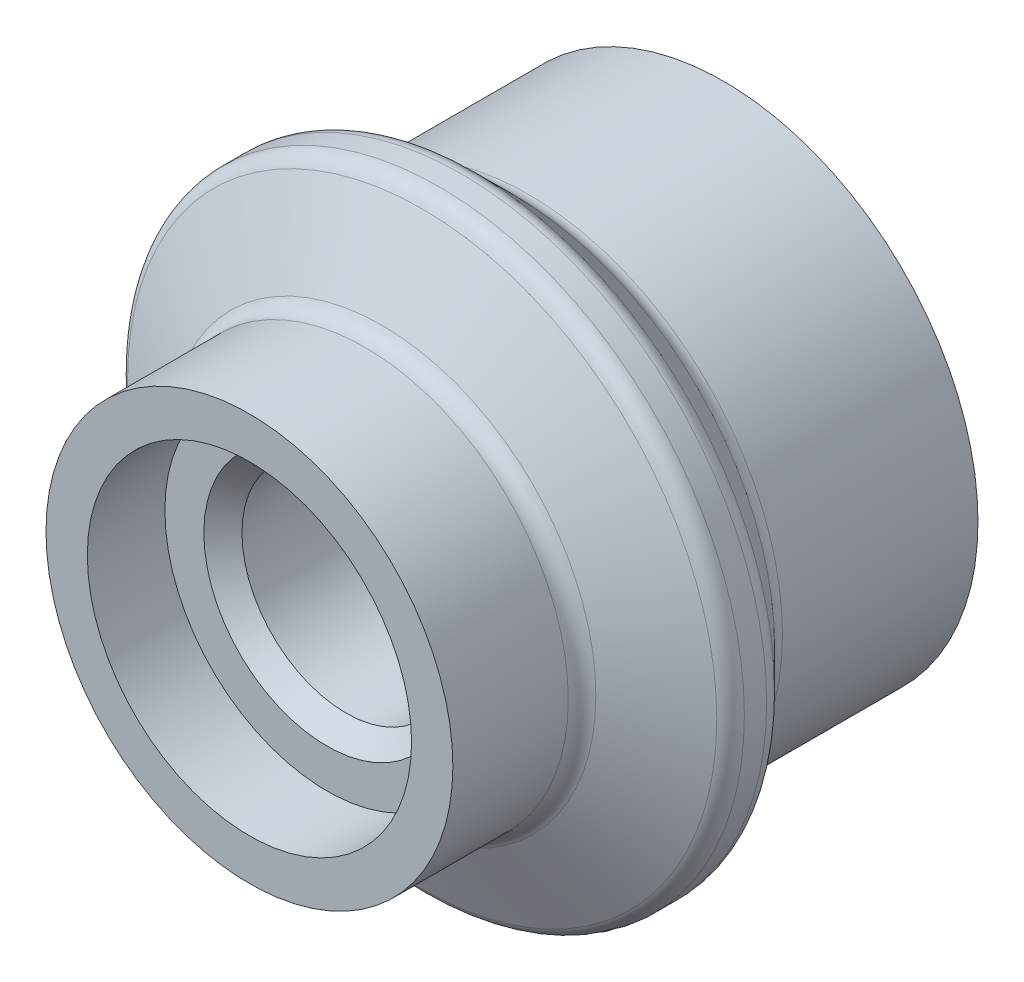
ISO-10303-21;
HEADER;
FILE_DESCRIPTION(('STEP AP214'),'2;1');
FILE_NAME('part.step','',(''),(''),'','','');
FILE_SCHEMA(('AUTOMOTIVE_DESIGN { 1 0 10303 214 1 1 1 1 }'));
ENDSEC;
DATA;
#1=APPLICATION_CONTEXT('core data for automotive mechanical design processes');
#2=APPLICATION_PROTOCOL_DEFINITION('international standard','automotive_design',2000,#1);
#3=PRODUCT_CONTEXT('',#1,'mechanical');
#4=PRODUCT('Part','Part','',(#3));
#5=PRODUCT_RELATED_PRODUCT_CATEGORY('part','',(#4));
#6=PRODUCT_DEFINITION_FORMATION('','',#4);
#7=PRODUCT_DEFINITION_CONTEXT('part definition',#1,'design');
#8=PRODUCT_DEFINITION('design','',#6,#7);
#9=PRODUCT_DEFINITION_SHAPE('','',#8);
#10=(LENGTH_UNIT() NAMED_UNIT(*) SI_UNIT(.MILLI.,.METRE.));
#11=(NAMED_UNIT(*) PLANE_ANGLE_UNIT() SI_UNIT($,.RADIAN.));
#12=(NAMED_UNIT(*) SI_UNIT($,.STERADIAN.) SOLID_ANGLE_UNIT());
#13=UNCERTAINTY_MEASURE_WITH_UNIT(LENGTH_MEASURE(1.E-05),#10,'distance_accuracy_value','');
#14=(GEOMETRIC_REPRESENTATION_CONTEXT(3) GLOBAL_UNCERTAINTY_ASSIGNED_CONTEXT((#13)) GLOBAL_UNIT_ASSIGNED_CONTEXT((#10,
#11,#12)) REPRESENTATION_CONTEXT('',''));
#15=CARTESIAN_POINT('',(0.,0.,0.));
#16=DIRECTION('',(0.,0.,1.));
#17=DIRECTION('',(1.,0.,0.));
#18=AXIS2_PLACEMENT_3D('',#15,#16,#17);
#19=CARTESIAN_POINT('',(0.,0.,0.));
#20=DIRECTION('',(0.,0.,1.));
#21=DIRECTION('',(1.,0.,0.));
#22=AXIS2_PLACEMENT_3D('',#19,#20,#21);
#23=PLANE('',#22);
#24=CARTESIAN_POINT('',(0.,0.,0.));
#25=DIRECTION('',(0.,0.,-1.));
#26=DIRECTION('',(-1.,0.,0.));
#27=AXIS2_PLACEMENT_3D('',#24,#25,#26);
#28=CIRCLE('',#27,11.5);
#29=CARTESIAN_POINT('',(-11.5,0.,0.));
#30=VERTEX_POINT('',#29);
#31=EDGE_CURVE('E96',#30,#30,#28,.T.);
#32=ORIENTED_EDGE('',*,*,#31,.F.);
#33=EDGE_LOOP('',(#32));
#34=FACE_BOUND('',#33,.T.);
#35=CARTESIAN_POINT('',(0.,0.,0.));
#36=DIRECTION('',(0.,0.,-1.));
#37=DIRECTION('',(-1.,0.,0.));
#38=AXIS2_PLACEMENT_3D('',#35,#36,#37);
#39=CIRCLE('',#38,20.);
#40=CARTESIAN_POINT('',(-20.,0.,0.));
#41=VERTEX_POINT('',#40);
#42=EDGE_CURVE('E103',#41,#41,#39,.T.);
#43=ORIENTED_EDGE('',*,*,#42,.T.);
#44=EDGE_LOOP('',(#43));
#45=FACE_BOUND('',#44,.T.);
#46=ADVANCED_FACE('F42',(#34,#45),#23,.F.);
#47=CARTESIAN_POINT('',(0.,0.,105.182250993909));
#48=DIRECTION('',(0.,0.,-1.));
#49=DIRECTION('',(-1.,0.,0.));
#50=AXIS2_PLACEMENT_3D('',#47,#48,#49);
#51=CYLINDRICAL_SURFACE('',#50,24.);
#52=CARTESIAN_POINT('',(0.,0.,20.6213203435597));
#53=DIRECTION('',(0.,0.,1.));
#54=DIRECTION('',(1.,0.,0.));
#55=AXIS2_PLACEMENT_3D('',#52,#53,#54);
#56=CIRCLE('',#55,24.);
#57=CARTESIAN_POINT('',(24.,0.,20.6213203435597));
#58=VERTEX_POINT('',#57);
#59=EDGE_CURVE('E51',#58,#58,#56,.T.);
#60=ORIENTED_EDGE('',*,*,#59,.T.);
#61=EDGE_LOOP('',(#60));
#62=FACE_BOUND('',#61,.T.);
#63=CARTESIAN_POINT('',(0.,0.,22.3729490168752));
#64=DIRECTION('',(0.,0.,1.));
#65=DIRECTION('',(1.,0.,0.));
#66=AXIS2_PLACEMENT_3D('',#63,#64,#65);
#67=CIRCLE('',#66,24.);
#68=CARTESIAN_POINT('',(24.,0.,22.3729490168752));
#69=VERTEX_POINT('',#68);
#70=EDGE_CURVE('E75',#69,#69,#67,.F.);
#71=ORIENTED_EDGE('',*,*,#70,.T.);
#72=EDGE_LOOP('',(#71));
#73=FACE_BOUND('',#72,.T.);
#74=ADVANCED_FACE('F126',(#62,#73),#51,.T.);
#75=CARTESIAN_POINT('',(0.,0.,37.3));
#76=DIRECTION('',(0.,0.,-1.));
#77=DIRECTION('',(-1.,0.,0.));
#78=AXIS2_PLACEMENT_3D('',#75,#76,#77);
#79=CYLINDRICAL_SURFACE('',#78,8.1875);
#80=CARTESIAN_POINT('',(0.,0.,29.7));
#81=DIRECTION('',(0.,0.,1.));
#82=DIRECTION('',(1.,0.,0.));
#83=AXIS2_PLACEMENT_3D('',#80,#81,#82);
#84=CIRCLE('',#83,8.1875);
#85=CARTESIAN_POINT('',(8.1875,0.,29.7));
#86=VERTEX_POINT('',#85);
#87=EDGE_CURVE('E85',#86,#86,#84,.T.);
#88=ORIENTED_EDGE('',*,*,#87,.T.);
#89=EDGE_LOOP('',(#88));
#90=FACE_BOUND('',#89,.T.);
#91=CARTESIAN_POINT('',(0.,0.,3.50000000000002));
#92=DIRECTION('',(0.,0.,-1.));
#93=DIRECTION('',(-1.,0.,0.));
#94=AXIS2_PLACEMENT_3D('',#91,#92,#93);
#95=CIRCLE('',#94,8.1875);
#96=CARTESIAN_POINT('',(-8.1875,0.,3.50000000000002));
#97=VERTEX_POINT('',#96);
#98=EDGE_CURVE('E84',#97,#97,#95,.T.);
#99=ORIENTED_EDGE('',*,*,#98,.T.);
#100=EDGE_LOOP('',(#99));
#101=FACE_BOUND('',#100,.T.);
#102=ADVANCED_FACE('F132',(#90,#101),#79,.F.);
#103=CARTESIAN_POINT('',(0.,0.,37.3));
#104=DIRECTION('',(0.,0.,1.));
#105=DIRECTION('',(1.,0.,0.));
#106=AXIS2_PLACEMENT_3D('',#103,#104,#105);
#107=PLANE('',#106);
#108=CARTESIAN_POINT('',(0.,0.,37.3));
#109=DIRECTION('',(0.,0.,1.));
#110=DIRECTION('',(1.,0.,0.));
#111=AXIS2_PLACEMENT_3D('',#108,#109,#110);
#112=CIRCLE('',#111,12.75);
#113=CARTESIAN_POINT('',(12.75,0.,37.3));
#114=VERTEX_POINT('',#113);
#115=EDGE_CURVE('E91',#114,#114,#112,.T.);
#116=ORIENTED_EDGE('',*,*,#115,.F.);
#117=EDGE_LOOP('',(#116));
#118=FACE_BOUND('',#117,.T.);
#119=CARTESIAN_POINT('',(0.,0.,37.3));
#120=DIRECTION('',(0.,0.,1.));
#121=DIRECTION('',(1.,0.,0.));
#122=AXIS2_PLACEMENT_3D('',#119,#120,#121);
#123=CIRCLE('',#122,16.);
#124=CARTESIAN_POINT('',(16.,0.,37.3));
#125=VERTEX_POINT('',#124);
#126=EDGE_CURVE('E87',#125,#125,#123,.T.);
#127=ORIENTED_EDGE('',*,*,#126,.T.);
#128=EDGE_LOOP('',(#127));
#129=FACE_BOUND('',#128,.T.);
#130=ADVANCED_FACE('F140',(#118,#129),#107,.T.);
#131=CARTESIAN_POINT('',(0.,0.,37.3));
#132=DIRECTION('',(0.,0.,-1.));
#133=DIRECTION('',(-1.,0.,0.));
#134=AXIS2_PLACEMENT_3D('',#131,#132,#133);
#135=CYLINDRICAL_SURFACE('',#134,16.);
#136=CARTESIAN_POINT('',(0.,0.,28.2270509831248));
#137=DIRECTION('',(0.,0.,-1.));
#138=DIRECTION('',(-1.,0.,0.));
#139=AXIS2_PLACEMENT_3D('',#136,#137,#138);
#140=CIRCLE('',#139,16.);
#141=CARTESIAN_POINT('',(-16.,0.,28.2270509831248));
#142=VERTEX_POINT('',#141);
#143=EDGE_CURVE('E63',#142,#142,#140,.F.);
#144=ORIENTED_EDGE('',*,*,#143,.T.);
#145=EDGE_LOOP('',(#144));
#146=FACE_BOUND('',#145,.T.);
#147=ORIENTED_EDGE('',*,*,#126,.F.);
#148=EDGE_LOOP('',(#147));
#149=FACE_BOUND('',#148,.T.);
#150=ADVANCED_FACE('F137',(#146,#149),#135,.T.);
#151=CARTESIAN_POINT('',(0.,0.,31.2));
#152=DIRECTION('',(0.,0.,1.));
#153=DIRECTION('',(1.,0.,0.));
#154=AXIS2_PLACEMENT_3D('',#151,#152,#153);
#155=CYLINDRICAL_SURFACE('',#154,12.75);
#156=CARTESIAN_POINT('',(0.,0.,31.2));
#157=DIRECTION('',(0.,0.,1.));
#158=DIRECTION('',(1.,0.,0.));
#159=AXIS2_PLACEMENT_3D('',#156,#157,#158);
#160=CIRCLE('',#159,12.75);
#161=CARTESIAN_POINT('',(12.75,0.,31.2));
#162=VERTEX_POINT('',#161);
#163=EDGE_CURVE('E94',#162,#162,#160,.T.);
#164=ORIENTED_EDGE('',*,*,#163,.F.);
#165=EDGE_LOOP('',(#164));
#166=FACE_BOUND('',#165,.T.);
#167=ORIENTED_EDGE('',*,*,#115,.T.);
#168=EDGE_LOOP('',(#167));
#169=FACE_BOUND('',#168,.T.);
#170=ADVANCED_FACE('F145',(#166,#169),#155,.F.);
#171=CARTESIAN_POINT('',(0.,0.,31.2));
#172=DIRECTION('',(0.,0.,1.));
#173=DIRECTION('',(1.,0.,0.));
#174=AXIS2_PLACEMENT_3D('',#171,#172,#173);
#175=PLANE('',#174);
#176=CARTESIAN_POINT('',(0.,0.,31.2));
#177=DIRECTION('',(0.,0.,1.));
#178=DIRECTION('',(1.,0.,0.));
#179=AXIS2_PLACEMENT_3D('',#176,#177,#178);
#180=CIRCLE('',#179,9.68750000000002);
#181=CARTESIAN_POINT('',(9.68750000000002,0.,31.2));
#182=VERTEX_POINT('',#181);
#183=EDGE_CURVE('E79',#182,#182,#180,.F.);
#184=ORIENTED_EDGE('',*,*,#183,.T.);
#185=EDGE_LOOP('',(#184));
#186=FACE_BOUND('',#185,.T.);
#187=ORIENTED_EDGE('',*,*,#163,.T.);
#188=EDGE_LOOP('',(#187));
#189=FACE_BOUND('',#188,.T.);
#190=ADVANCED_FACE('F258',(#186,#189),#175,.T.);
#191=CARTESIAN_POINT('',(0.,0.,2.));
#192=DIRECTION('',(0.,0.,-1.));
#193=DIRECTION('',(-1.,0.,0.));
#194=AXIS2_PLACEMENT_3D('',#191,#192,#193);
#195=CYLINDRICAL_SURFACE('',#194,11.5);
#196=CARTESIAN_POINT('',(0.,0.,2.));
#197=DIRECTION('',(0.,0.,-1.));
#198=DIRECTION('',(-1.,0.,0.));
#199=AXIS2_PLACEMENT_3D('',#196,#197,#198);
#200=CIRCLE('',#199,11.5);
#201=CARTESIAN_POINT('',(-11.5,0.,2.));
#202=VERTEX_POINT('',#201);
#203=EDGE_CURVE('E92',#202,#202,#200,.T.);
#204=ORIENTED_EDGE('',*,*,#203,.F.);
#205=EDGE_LOOP('',(#204));
#206=FACE_BOUND('',#205,.T.);
#207=ORIENTED_EDGE('',*,*,#31,.T.);
#208=EDGE_LOOP('',(#207));
#209=FACE_BOUND('',#208,.T.);
#210=ADVANCED_FACE('F125',(#206,#209),#195,.F.);
#211=CARTESIAN_POINT('',(0.,0.,2.));
#212=DIRECTION('',(0.,0.,-1.));
#213=DIRECTION('',(-1.,0.,0.));
#214=AXIS2_PLACEMENT_3D('',#211,#212,#213);
#215=PLANE('',#214);
#216=CARTESIAN_POINT('',(0.,0.,2.));
#217=DIRECTION('',(0.,0.,-1.));
#218=DIRECTION('',(-1.,0.,0.));
#219=AXIS2_PLACEMENT_3D('',#216,#217,#218);
#220=CIRCLE('',#219,9.68750000000002);
#221=CARTESIAN_POINT('',(-9.68750000000002,0.,2.));
#222=VERTEX_POINT('',#221);
#223=EDGE_CURVE('E77',#222,#222,#220,.F.);
#224=ORIENTED_EDGE('',*,*,#223,.T.);
#225=EDGE_LOOP('',(#224));
#226=FACE_BOUND('',#225,.T.);
#227=ORIENTED_EDGE('',*,*,#203,.T.);
#228=EDGE_LOOP('',(#227));
#229=FACE_BOUND('',#228,.T.);
#230=ADVANCED_FACE('F111',(#226,#229),#215,.T.);
#231=CARTESIAN_POINT('',(0.,0.,20.));
#232=DIRECTION('',(0.,0.,-1.));
#233=DIRECTION('',(-1.,0.,0.));
#234=AXIS2_PLACEMENT_3D('',#231,#232,#233);
#235=CYLINDRICAL_SURFACE('',#234,20.);
#236=CARTESIAN_POINT('',(0.,0.,15.3786796564403));
#237=DIRECTION('',(0.,0.,-1.));
#238=DIRECTION('',(-1.,0.,0.));
#239=AXIS2_PLACEMENT_3D('',#236,#237,#238);
#240=CIRCLE('',#239,20.);
#241=CARTESIAN_POINT('',(-20.,0.,15.3786796564403));
#242=VERTEX_POINT('',#241);
#243=EDGE_CURVE('E12',#242,#242,#240,.T.);
#244=ORIENTED_EDGE('',*,*,#243,.T.);
#245=EDGE_LOOP('',(#244));
#246=FACE_BOUND('',#245,.T.);
#247=ORIENTED_EDGE('',*,*,#42,.F.);
#248=EDGE_LOOP('',(#247));
#249=FACE_BOUND('',#248,.T.);
#250=ADVANCED_FACE('F108',(#246,#249),#235,.T.);
#251=CARTESIAN_POINT('',(0.,0.,23.3));
#252=DIRECTION('',(0.,0.,-1.));
#253=DIRECTION('',(-1.,0.,0.));
#254=AXIS2_PLACEMENT_3D('',#251,#252,#253);
#255=CONICAL_SURFACE('',#254,24.,1.10714871779409);
#256=CARTESIAN_POINT('',(0.,0.,23.714589803375));
#257=DIRECTION('',(0.,0.,1.));
#258=DIRECTION('',(1.,0.,0.));
#259=AXIS2_PLACEMENT_3D('',#256,#257,#258);
#260=CIRCLE('',#259,23.1708203932499);
#261=CARTESIAN_POINT('',(23.1708203932499,0.,23.714589803375));
#262=VERTEX_POINT('',#261);
#263=EDGE_CURVE('E70',#262,#262,#260,.T.);
#264=ORIENTED_EDGE('',*,*,#263,.T.);
#265=EDGE_LOOP('',(#264));
#266=FACE_BOUND('',#265,.T.);
#267=CARTESIAN_POINT('',(0.,0.,26.8854101966249));
#268=DIRECTION('',(0.,0.,1.));
#269=DIRECTION('',(1.,0.,0.));
#270=AXIS2_PLACEMENT_3D('',#267,#268,#269);
#271=CIRCLE('',#270,16.8291796067501);
#272=CARTESIAN_POINT('',(16.8291796067501,0.,26.8854101966249));
#273=VERTEX_POINT('',#272);
#274=EDGE_CURVE('E69',#273,#273,#271,.F.);
#275=ORIENTED_EDGE('',*,*,#274,.T.);
#276=EDGE_LOOP('',(#275));
#277=FACE_BOUND('',#276,.T.);
#278=ADVANCED_FACE('F109',(#266,#277),#255,.T.);
#279=CARTESIAN_POINT('',(0.,0.,29.7));
#280=DIRECTION('',(0.,0.,1.));
#281=DIRECTION('',(1.,0.,0.));
#282=AXIS2_PLACEMENT_3D('',#279,#280,#281);
#283=CONICAL_SURFACE('',#282,8.1875,0.785398163397452);
#284=CARTESIAN_POINT('',(9.68750000000002,0.,31.2));
#285=CARTESIAN_POINT('',(9.67187500000002,0.,31.184375));
#286=CARTESIAN_POINT('',(9.65625000000002,0.,31.16875));
#287=CARTESIAN_POINT('',(9.62500000000002,0.,31.1375));
#288=CARTESIAN_POINT('',(9.60937500000002,0.,31.121875));
#289=CARTESIAN_POINT('',(9.57812500000002,0.,31.090625));
#290=CARTESIAN_POINT('',(9.56250000000002,0.,31.075));
#291=CARTESIAN_POINT('',(9.53125000000002,0.,31.04375));
#292=CARTESIAN_POINT('',(9.51562500000002,0.,31.028125));
#293=CARTESIAN_POINT('',(9.48437500000002,0.,30.996875));
#294=CARTESIAN_POINT('',(9.46875000000002,0.,30.98125));
#295=CARTESIAN_POINT('',(9.43750000000002,0.,30.95));
#296=CARTESIAN_POINT('',(9.42187500000002,0.,30.934375));
#297=CARTESIAN_POINT('',(9.39062500000002,0.,30.903125));
#298=CARTESIAN_POINT('',(9.37500000000002,0.,30.8875));
#299=CARTESIAN_POINT('',(9.34375000000002,0.,30.85625));
#300=CARTESIAN_POINT('',(9.32812500000002,0.,30.840625));
#301=CARTESIAN_POINT('',(9.29687500000002,0.,30.809375));
#302=CARTESIAN_POINT('',(9.28125000000001,0.,30.79375));
#303=CARTESIAN_POINT('',(9.25000000000001,0.,30.7625));
#304=CARTESIAN_POINT('',(9.23437500000001,0.,30.746875));
#305=CARTESIAN_POINT('',(9.20312500000001,0.,30.715625));
#306=CARTESIAN_POINT('',(9.18750000000001,0.,30.7));
#307=CARTESIAN_POINT('',(9.15625000000001,0.,30.66875));
#308=CARTESIAN_POINT('',(9.14062500000001,0.,30.653125));
#309=CARTESIAN_POINT('',(9.10937500000001,0.,30.621875));
#310=CARTESIAN_POINT('',(9.09375000000001,0.,30.60625));
#311=CARTESIAN_POINT('',(9.06250000000001,0.,30.575));
#312=CARTESIAN_POINT('',(9.04687500000001,0.,30.559375));
#313=CARTESIAN_POINT('',(9.01562500000001,0.,30.528125));
#314=CARTESIAN_POINT('',(9.00000000000001,0.,30.5125));
#315=CARTESIAN_POINT('',(8.96875000000001,0.,30.48125));
#316=CARTESIAN_POINT('',(8.95312500000001,0.,30.465625));
#317=CARTESIAN_POINT('',(8.92187500000001,0.,30.434375));
#318=CARTESIAN_POINT('',(8.90625000000001,0.,30.41875));
#319=CARTESIAN_POINT('',(8.87500000000001,0.,30.3875));
#320=CARTESIAN_POINT('',(8.85937500000001,0.,30.371875));
#321=CARTESIAN_POINT('',(8.82812500000001,0.,30.340625));
#322=CARTESIAN_POINT('',(8.81250000000001,0.,30.325));
#323=CARTESIAN_POINT('',(8.78125000000001,0.,30.29375));
#324=CARTESIAN_POINT('',(8.76562500000001,0.,30.278125));
#325=CARTESIAN_POINT('',(8.73437500000001,0.,30.246875));
#326=CARTESIAN_POINT('',(8.71875000000001,0.,30.23125));
#327=CARTESIAN_POINT('',(8.68750000000001,0.,30.2));
#328=CARTESIAN_POINT('',(8.67187500000001,0.,30.184375));
#329=CARTESIAN_POINT('',(8.64062500000001,0.,30.153125));
#330=CARTESIAN_POINT('',(8.625,0.,30.1375));
#331=CARTESIAN_POINT('',(8.59375,0.,30.10625));
#332=CARTESIAN_POINT('',(8.578125,0.,30.090625));
#333=CARTESIAN_POINT('',(8.546875,0.,30.059375));
#334=CARTESIAN_POINT('',(8.53125,0.,30.04375));
#335=CARTESIAN_POINT('',(8.5,0.,30.0125));
#336=CARTESIAN_POINT('',(8.484375,0.,29.996875));
#337=CARTESIAN_POINT('',(8.453125,0.,29.965625));
#338=CARTESIAN_POINT('',(8.4375,0.,29.95));
#339=CARTESIAN_POINT('',(8.40625,0.,29.91875));
#340=CARTESIAN_POINT('',(8.390625,0.,29.903125));
#341=CARTESIAN_POINT('',(8.359375,0.,29.871875));
#342=CARTESIAN_POINT('',(8.34375,0.,29.85625));
#343=CARTESIAN_POINT('',(8.3125,0.,29.825));
#344=CARTESIAN_POINT('',(8.296875,0.,29.809375));
#345=CARTESIAN_POINT('',(8.265625,0.,29.778125));
#346=CARTESIAN_POINT('',(8.25,0.,29.7625));
#347=CARTESIAN_POINT('',(8.21875,0.,29.73125));
#348=CARTESIAN_POINT('',(8.203125,0.,29.715625));
#349=CARTESIAN_POINT('',(8.1875,0.,29.7));
#350=B_SPLINE_CURVE_WITH_KNOTS('',3,(#284,#285,#286,#287,#288,#289,#290,#291,#292,#293,#294,
#295,#296,#297,#298,#299,#300,#301,#302,#303,#304,#305,#306,#307,#308,#309,#310,#311,#312,#313,
#314,#315,#316,#317,#318,#319,#320,#321,#322,#323,#324,#325,#326,#327,#328,#329,#330,#331,#332,
#333,#334,#335,#336,#337,#338,#339,#340,#341,#342,#343,#344,#345,#346,#347,#348,#349),
.UNSPECIFIED.,.F.,.F.,(4,2,2,2,2,2,2,2,2,2,2,2,2,2,2,2,2,2,2,2,2,2,2,2,2,2,2,2,2,2,2,2,4),(0.,
0.0662912607362377,0.132582521472479,0.198873782208717,0.265165042944957,0.331456303681198,
0.397747564417436,0.464038825153677,0.530330085889915,0.596621346626156,0.662912607362394,
0.729203868098634,0.795495128834875,0.861786389571113,0.928077650307353,0.994368911043592,
1.06066017177983,1.12695143251607,1.19324269325231,1.25953395398855,1.32582521472479,
1.39211647546103,1.45840773619727,1.52469899693351,1.59099025766975,1.65728151840599,
1.72357277914223,1.78986403987847,1.85615530061471,1.92244656135095,1.98873782208718,
2.05502908282343,2.12132034355966),.UNSPECIFIED.);
#351=EDGE_CURVE('BSEAM117',#182,#86,#350,.T.);
#352=ORIENTED_EDGE('',*,*,#183,.F.);
#353=ORIENTED_EDGE('',*,*,#87,.F.);
#354=ORIENTED_EDGE('',*,*,#351,.T.);
#355=ORIENTED_EDGE('',*,*,#351,.F.);
#356=EDGE_LOOP('',(#352,#354,#353,#355));
#357=FACE_BOUND('',#356,.T.);
#358=ADVANCED_FACE('F117',(#357),#283,.F.);
#359=CARTESIAN_POINT('',(0.,0.,3.50000000000002));
#360=DIRECTION('',(0.,0.,-1.));
#361=DIRECTION('',(-1.,0.,0.));
#362=AXIS2_PLACEMENT_3D('',#359,#360,#361);
#363=CONICAL_SURFACE('',#362,8.1875,0.785398163397448);
#364=ORIENTED_EDGE('',*,*,#223,.F.);
#365=EDGE_LOOP('',(#364));
#366=FACE_BOUND('',#365,.T.);
#367=ORIENTED_EDGE('',*,*,#98,.F.);
#368=EDGE_LOOP('',(#367));
#369=FACE_BOUND('',#368,.T.);
#370=ADVANCED_FACE('F153',(#366,#369),#363,.F.);
#371=CARTESIAN_POINT('',(0.,0.,22.3729490168752));
#372=DIRECTION('',(0.,0.,1.));
#373=DIRECTION('',(1.,0.,0.));
#374=AXIS2_PLACEMENT_3D('',#371,#372,#373);
#375=TOROIDAL_SURFACE('',#374,22.5,1.5);
#376=ORIENTED_EDGE('',*,*,#263,.F.);
#377=EDGE_LOOP('',(#376));
#378=FACE_BOUND('',#377,.T.);
#379=ORIENTED_EDGE('',*,*,#70,.F.);
#380=EDGE_LOOP('',(#379));
#381=FACE_BOUND('',#380,.T.);
#382=ADVANCED_FACE('F163',(#378,#381),#375,.T.);
#383=CARTESIAN_POINT('',(0.,0.,28.2270509831248));
#384=DIRECTION('',(0.,0.,-1.));
#385=DIRECTION('',(-1.,0.,0.));
#386=AXIS2_PLACEMENT_3D('',#383,#384,#385);
#387=TOROIDAL_SURFACE('',#386,17.5,1.5);
#388=ORIENTED_EDGE('',*,*,#143,.F.);
#389=EDGE_LOOP('',(#388));
#390=FACE_BOUND('',#389,.T.);
#391=ORIENTED_EDGE('',*,*,#274,.F.);
#392=EDGE_LOOP('',(#391));
#393=FACE_BOUND('',#392,.T.);
#394=ADVANCED_FACE('F164',(#390,#393),#387,.F.);
#395=CARTESIAN_POINT('',(0.,0.,16.));
#396=DIRECTION('',(0.,0.,1.));
#397=DIRECTION('',(1.,0.,0.));
#398=AXIS2_PLACEMENT_3D('',#395,#396,#397);
#399=CONICAL_SURFACE('',#398,20.,0.785398163397442);
#400=CARTESIAN_POINT('',(0.,0.,19.5606601717798));
#401=DIRECTION('',(0.,0.,1.));
#402=DIRECTION('',(1.,0.,0.));
#403=AXIS2_PLACEMENT_3D('',#400,#401,#402);
#404=CIRCLE('',#403,23.5606601717798);
#405=CARTESIAN_POINT('',(23.5606601717798,0.,19.5606601717798));
#406=VERTEX_POINT('',#405);
#407=EDGE_CURVE('E54',#406,#406,#404,.F.);
#408=ORIENTED_EDGE('',*,*,#407,.T.);
#409=EDGE_LOOP('',(#408));
#410=FACE_BOUND('',#409,.T.);
#411=CARTESIAN_POINT('',(0.,0.,16.4393398282201));
#412=DIRECTION('',(0.,0.,-1.));
#413=DIRECTION('',(-1.,0.,0.));
#414=AXIS2_PLACEMENT_3D('',#411,#412,#413);
#415=CIRCLE('',#414,20.4393398282202);
#416=CARTESIAN_POINT('',(-20.4393398282202,0.,16.4393398282201));
#417=VERTEX_POINT('',#416);
#418=EDGE_CURVE('E56',#417,#417,#415,.F.);
#419=ORIENTED_EDGE('',*,*,#418,.T.);
#420=EDGE_LOOP('',(#419));
#421=FACE_BOUND('',#420,.T.);
#422=ADVANCED_FACE('F169',(#410,#421),#399,.T.);
#423=CARTESIAN_POINT('',(0.,0.,20.6213203435597));
#424=DIRECTION('',(0.,0.,1.));
#425=DIRECTION('',(1.,0.,0.));
#426=AXIS2_PLACEMENT_3D('',#423,#424,#425);
#427=TOROIDAL_SURFACE('',#426,22.5,1.5);
#428=ORIENTED_EDGE('',*,*,#59,.F.);
#429=EDGE_LOOP('',(#428));
#430=FACE_BOUND('',#429,.T.);
#431=ORIENTED_EDGE('',*,*,#407,.F.);
#432=EDGE_LOOP('',(#431));
#433=FACE_BOUND('',#432,.T.);
#434=ADVANCED_FACE('F173',(#430,#433),#427,.T.);
#435=CARTESIAN_POINT('',(0.,0.,15.3786796564403));
#436=DIRECTION('',(0.,0.,-1.));
#437=DIRECTION('',(-1.,0.,0.));
#438=AXIS2_PLACEMENT_3D('',#435,#436,#437);
#439=TOROIDAL_SURFACE('',#438,21.5,1.5);
#440=ORIENTED_EDGE('',*,*,#418,.F.);
#441=EDGE_LOOP('',(#440));
#442=FACE_BOUND('',#441,.T.);
#443=ORIENTED_EDGE('',*,*,#243,.F.);
#444=EDGE_LOOP('',(#443));
#445=FACE_BOUND('',#444,.T.);
#446=ADVANCED_FACE('F46',(#442,#445),#439,.F.);
#447=CLOSED_SHELL('',(#46,#74,#102,#130,#150,#170,#190,#210,#230,#250,#278,#358,#370,#382,#394,
#422,#434,#446));
#448=MANIFOLD_SOLID_BREP('B2',#447);
#449=ADVANCED_BREP_SHAPE_REPRESENTATION('',(#18,#448),#14);
#450=SHAPE_DEFINITION_REPRESENTATION(#9,#449);
ENDSEC;
END-ISO-10303-21;
